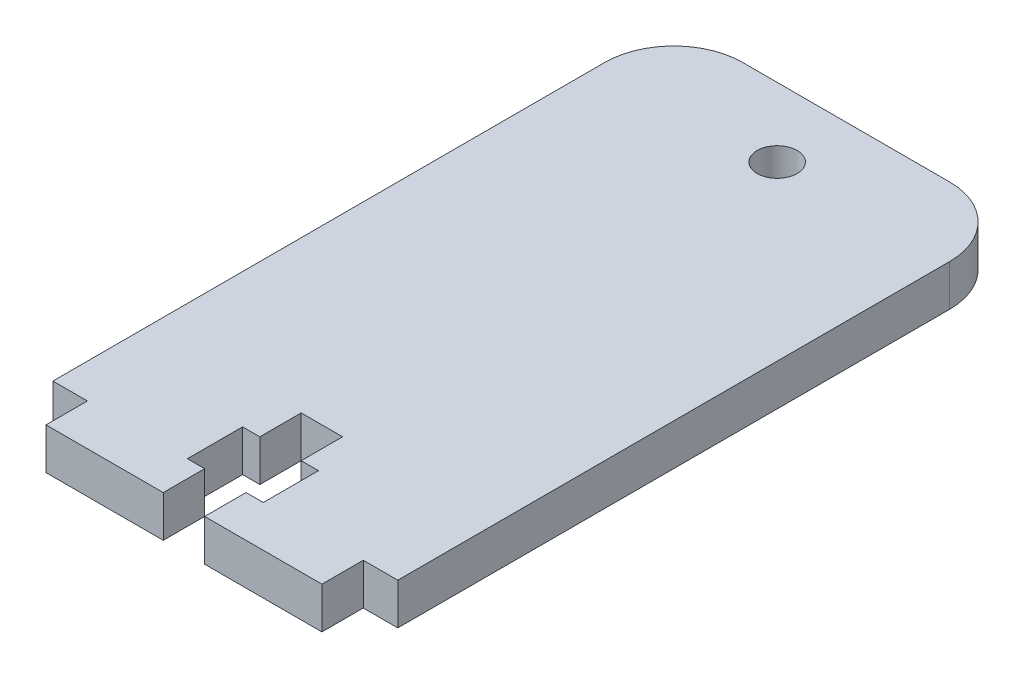
ISO-10303-21;
HEADER;
FILE_DESCRIPTION(('STEP AP214'),'2;1');
FILE_NAME('part.step','',(''),(''),'','','');
FILE_SCHEMA(('AUTOMOTIVE_DESIGN { 1 0 10303 214 1 1 1 1 }'));
ENDSEC;
DATA;
#1=APPLICATION_CONTEXT('core data for automotive mechanical design processes');
#2=APPLICATION_PROTOCOL_DEFINITION('international standard','automotive_design',2000,#1);
#3=PRODUCT_CONTEXT('',#1,'mechanical');
#4=PRODUCT('Part','Part','',(#3));
#5=PRODUCT_RELATED_PRODUCT_CATEGORY('part','',(#4));
#6=PRODUCT_DEFINITION_FORMATION('','',#4);
#7=PRODUCT_DEFINITION_CONTEXT('part definition',#1,'design');
#8=PRODUCT_DEFINITION('design','',#6,#7);
#9=PRODUCT_DEFINITION_SHAPE('','',#8);
#10=(LENGTH_UNIT() NAMED_UNIT(*) SI_UNIT(.MILLI.,.METRE.));
#11=(NAMED_UNIT(*) PLANE_ANGLE_UNIT() SI_UNIT($,.RADIAN.));
#12=(NAMED_UNIT(*) SI_UNIT($,.STERADIAN.) SOLID_ANGLE_UNIT());
#13=UNCERTAINTY_MEASURE_WITH_UNIT(LENGTH_MEASURE(1.E-05),#10,'distance_accuracy_value','');
#14=(GEOMETRIC_REPRESENTATION_CONTEXT(3) GLOBAL_UNCERTAINTY_ASSIGNED_CONTEXT((#13)) GLOBAL_UNIT_ASSIGNED_CONTEXT((#10,
#11,#12)) REPRESENTATION_CONTEXT('',''));
#15=CARTESIAN_POINT('',(0.,0.,0.));
#16=DIRECTION('',(0.,0.,1.));
#17=DIRECTION('',(1.,0.,0.));
#18=AXIS2_PLACEMENT_3D('',#15,#16,#17);
#19=CARTESIAN_POINT('',(0.,3.,0.));
#20=DIRECTION('',(0.,0.,-1.));
#21=DIRECTION('',(-1.,0.,0.));
#22=AXIS2_PLACEMENT_3D('',#19,#20,#21);
#23=PLANE('',#22);
#24=DIRECTION('',(1.,0.,0.));
#25=VECTOR('',#24,1.);
#26=CARTESIAN_POINT('',(0.,0.,0.));
#27=LINE('',#26,#25);
#28=CARTESIAN_POINT('',(5.00000000000004,0.,0.));
#29=VERTEX_POINT('',#28);
#30=CARTESIAN_POINT('',(20.,0.,0.));
#31=VERTEX_POINT('',#30);
#32=EDGE_CURVE('E236',#29,#31,#27,.T.);
#33=ORIENTED_EDGE('',*,*,#32,.F.);
#34=DIRECTION('',(0.,-1.,0.));
#35=VECTOR('',#34,1.);
#36=CARTESIAN_POINT('',(5.00000000000004,3.,0.));
#37=LINE('',#36,#35);
#38=CARTESIAN_POINT('',(5.00000000000004,3.,0.));
#39=VERTEX_POINT('',#38);
#40=EDGE_CURVE('E11',#39,#29,#37,.T.);
#41=ORIENTED_EDGE('',*,*,#40,.F.);
#42=DIRECTION('',(1.,0.,0.));
#43=VECTOR('',#42,1.);
#44=CARTESIAN_POINT('',(0.,3.,0.));
#45=LINE('',#44,#43);
#46=CARTESIAN_POINT('',(20.,3.,0.));
#47=VERTEX_POINT('',#46);
#48=EDGE_CURVE('E474',#39,#47,#45,.T.);
#49=ORIENTED_EDGE('',*,*,#48,.T.);
#50=DIRECTION('',(0.,-1.,0.));
#51=VECTOR('',#50,1.);
#52=CARTESIAN_POINT('',(20.,3.,0.));
#53=LINE('',#52,#51);
#54=EDGE_CURVE('E141',#47,#31,#53,.T.);
#55=ORIENTED_EDGE('',*,*,#54,.T.);
#56=EDGE_LOOP('',(#33,#41,#49,#55));
#57=FACE_BOUND('',#56,.T.);
#58=ADVANCED_FACE('F47',(#57),#23,.T.);
#59=CARTESIAN_POINT('',(5.,3.,5.));
#60=DIRECTION('',(0.,-1.,0.));
#61=DIRECTION('',(0.,0.,-1.));
#62=AXIS2_PLACEMENT_3D('',#59,#60,#61);
#63=CYLINDRICAL_SURFACE('',#62,5.);
#64=CARTESIAN_POINT('',(5.,0.,5.));
#65=DIRECTION('',(0.,1.,0.));
#66=DIRECTION('',(0.,0.,1.));
#67=AXIS2_PLACEMENT_3D('',#64,#65,#66);
#68=CIRCLE('',#67,5.);
#69=CARTESIAN_POINT('',(0.,0.,5.00000000000004));
#70=VERTEX_POINT('',#69);
#71=EDGE_CURVE('E240',#29,#70,#68,.T.);
#72=ORIENTED_EDGE('',*,*,#71,.T.);
#73=DIRECTION('',(0.,-1.,0.));
#74=VECTOR('',#73,1.);
#75=CARTESIAN_POINT('',(0.,3.,5.00000000000004));
#76=LINE('',#75,#74);
#77=CARTESIAN_POINT('',(0.,3.,5.00000000000004));
#78=VERTEX_POINT('',#77);
#79=EDGE_CURVE('E57',#78,#70,#76,.T.);
#80=ORIENTED_EDGE('',*,*,#79,.F.);
#81=CARTESIAN_POINT('',(5.,3.,5.));
#82=DIRECTION('',(0.,1.,0.));
#83=DIRECTION('',(0.,0.,1.));
#84=AXIS2_PLACEMENT_3D('',#81,#82,#83);
#85=CIRCLE('',#84,5.);
#86=EDGE_CURVE('E477',#39,#78,#85,.T.);
#87=ORIENTED_EDGE('',*,*,#86,.F.);
#88=ORIENTED_EDGE('',*,*,#40,.T.);
#89=EDGE_LOOP('',(#72,#80,#87,#88));
#90=FACE_BOUND('',#89,.T.);
#91=ADVANCED_FACE('F387',(#90),#63,.T.);
#92=CARTESIAN_POINT('',(0.,3.,0.));
#93=DIRECTION('',(1.,0.,0.));
#94=DIRECTION('',(0.,0.,-1.));
#95=AXIS2_PLACEMENT_3D('',#92,#93,#94);
#96=PLANE('',#95);
#97=DIRECTION('',(0.,0.,1.));
#98=VECTOR('',#97,1.);
#99=CARTESIAN_POINT('',(0.,0.,0.));
#100=LINE('',#99,#98);
#101=CARTESIAN_POINT('',(0.,0.,45.));
#102=VERTEX_POINT('',#101);
#103=EDGE_CURVE('E244',#70,#102,#100,.T.);
#104=ORIENTED_EDGE('',*,*,#103,.T.);
#105=DIRECTION('',(0.,-1.,0.));
#106=VECTOR('',#105,1.);
#107=CARTESIAN_POINT('',(0.,3.,45.));
#108=LINE('',#107,#106);
#109=CARTESIAN_POINT('',(0.,3.,45.));
#110=VERTEX_POINT('',#109);
#111=EDGE_CURVE('E373',#110,#102,#108,.T.);
#112=ORIENTED_EDGE('',*,*,#111,.F.);
#113=DIRECTION('',(0.,0.,1.));
#114=VECTOR('',#113,1.);
#115=CARTESIAN_POINT('',(0.,3.,0.));
#116=LINE('',#115,#114);
#117=EDGE_CURVE('E383',#78,#110,#116,.T.);
#118=ORIENTED_EDGE('',*,*,#117,.F.);
#119=ORIENTED_EDGE('',*,*,#79,.T.);
#120=EDGE_LOOP('',(#104,#112,#118,#119));
#121=FACE_BOUND('',#120,.T.);
#122=ADVANCED_FACE('F380',(#121),#96,.F.);
#123=CARTESIAN_POINT('',(0.,3.,45.));
#124=DIRECTION('',(0.,0.,-1.));
#125=DIRECTION('',(-1.,0.,0.));
#126=AXIS2_PLACEMENT_3D('',#123,#124,#125);
#127=PLANE('',#126);
#128=DIRECTION('',(1.,0.,0.));
#129=VECTOR('',#128,1.);
#130=CARTESIAN_POINT('',(0.,0.,45.));
#131=LINE('',#130,#129);
#132=CARTESIAN_POINT('',(2.50000000000001,0.,45.));
#133=VERTEX_POINT('',#132);
#134=EDGE_CURVE('E248',#102,#133,#131,.T.);
#135=ORIENTED_EDGE('',*,*,#134,.T.);
#136=DIRECTION('',(0.,-1.,0.));
#137=VECTOR('',#136,1.);
#138=CARTESIAN_POINT('',(2.50000000000001,3.,45.));
#139=LINE('',#138,#137);
#140=CARTESIAN_POINT('',(2.50000000000001,3.,45.));
#141=VERTEX_POINT('',#140);
#142=EDGE_CURVE('E369',#141,#133,#139,.T.);
#143=ORIENTED_EDGE('',*,*,#142,.F.);
#144=DIRECTION('',(1.,0.,0.));
#145=VECTOR('',#144,1.);
#146=CARTESIAN_POINT('',(0.,3.,45.));
#147=LINE('',#146,#145);
#148=EDGE_CURVE('E212',#110,#141,#147,.T.);
#149=ORIENTED_EDGE('',*,*,#148,.F.);
#150=ORIENTED_EDGE('',*,*,#111,.T.);
#151=EDGE_LOOP('',(#135,#143,#149,#150));
#152=FACE_BOUND('',#151,.T.);
#153=ADVANCED_FACE('F398',(#152),#127,.F.);
#154=CARTESIAN_POINT('',(2.5,3.,0.));
#155=DIRECTION('',(1.,0.,0.));
#156=DIRECTION('',(0.,0.,-1.));
#157=AXIS2_PLACEMENT_3D('',#154,#155,#156);
#158=PLANE('',#157);
#159=DIRECTION('',(0.,0.,1.));
#160=VECTOR('',#159,1.);
#161=CARTESIAN_POINT('',(2.5,0.,0.));
#162=LINE('',#161,#160);
#163=CARTESIAN_POINT('',(2.50000000000001,0.,48.));
#164=VERTEX_POINT('',#163);
#165=EDGE_CURVE('E252',#133,#164,#162,.T.);
#166=ORIENTED_EDGE('',*,*,#165,.T.);
#167=DIRECTION('',(0.,-1.,0.));
#168=VECTOR('',#167,1.);
#169=CARTESIAN_POINT('',(2.50000000000001,3.,48.));
#170=LINE('',#169,#168);
#171=CARTESIAN_POINT('',(2.50000000000001,3.,48.));
#172=VERTEX_POINT('',#171);
#173=EDGE_CURVE('E365',#172,#164,#170,.T.);
#174=ORIENTED_EDGE('',*,*,#173,.F.);
#175=DIRECTION('',(0.,0.,1.));
#176=VECTOR('',#175,1.);
#177=CARTESIAN_POINT('',(2.5,3.,0.));
#178=LINE('',#177,#176);
#179=EDGE_CURVE('E486',#141,#172,#178,.T.);
#180=ORIENTED_EDGE('',*,*,#179,.F.);
#181=ORIENTED_EDGE('',*,*,#142,.T.);
#182=EDGE_LOOP('',(#166,#174,#180,#181));
#183=FACE_BOUND('',#182,.T.);
#184=ADVANCED_FACE('F399',(#183),#158,.F.);
#185=CARTESIAN_POINT('',(0.,3.,48.));
#186=DIRECTION('',(0.,0.,-1.));
#187=DIRECTION('',(-1.,0.,0.));
#188=AXIS2_PLACEMENT_3D('',#185,#186,#187);
#189=PLANE('',#188);
#190=DIRECTION('',(1.,0.,0.));
#191=VECTOR('',#190,1.);
#192=CARTESIAN_POINT('',(0.,0.,48.));
#193=LINE('',#192,#191);
#194=CARTESIAN_POINT('',(11.,0.,48.));
#195=VERTEX_POINT('',#194);
#196=EDGE_CURVE('E256',#164,#195,#193,.T.);
#197=ORIENTED_EDGE('',*,*,#196,.T.);
#198=DIRECTION('',(0.,-1.,0.));
#199=VECTOR('',#198,1.);
#200=CARTESIAN_POINT('',(11.,3.,48.));
#201=LINE('',#200,#199);
#202=CARTESIAN_POINT('',(11.,3.,48.));
#203=VERTEX_POINT('',#202);
#204=EDGE_CURVE('E361',#203,#195,#201,.T.);
#205=ORIENTED_EDGE('',*,*,#204,.F.);
#206=DIRECTION('',(1.,0.,0.));
#207=VECTOR('',#206,1.);
#208=CARTESIAN_POINT('',(0.,3.,48.));
#209=LINE('',#208,#207);
#210=EDGE_CURVE('E490',#172,#203,#209,.T.);
#211=ORIENTED_EDGE('',*,*,#210,.F.);
#212=ORIENTED_EDGE('',*,*,#173,.T.);
#213=EDGE_LOOP('',(#197,#205,#211,#212));
#214=FACE_BOUND('',#213,.T.);
#215=ADVANCED_FACE('F402',(#214),#189,.F.);
#216=CARTESIAN_POINT('',(11.,3.,0.));
#217=DIRECTION('',(-1.,0.,0.));
#218=DIRECTION('',(0.,0.,1.));
#219=AXIS2_PLACEMENT_3D('',#216,#217,#218);
#220=PLANE('',#219);
#221=DIRECTION('',(0.,0.,-1.));
#222=VECTOR('',#221,1.);
#223=CARTESIAN_POINT('',(11.,0.,0.));
#224=LINE('',#223,#222);
#225=CARTESIAN_POINT('',(11.,0.,45.));
#226=VERTEX_POINT('',#225);
#227=EDGE_CURVE('E260',#195,#226,#224,.T.);
#228=ORIENTED_EDGE('',*,*,#227,.T.);
#229=DIRECTION('',(0.,-1.,0.));
#230=VECTOR('',#229,1.);
#231=CARTESIAN_POINT('',(11.,3.,45.));
#232=LINE('',#231,#230);
#233=CARTESIAN_POINT('',(11.,3.,45.));
#234=VERTEX_POINT('',#233);
#235=EDGE_CURVE('E358',#234,#226,#232,.T.);
#236=ORIENTED_EDGE('',*,*,#235,.F.);
#237=DIRECTION('',(0.,0.,-1.));
#238=VECTOR('',#237,1.);
#239=CARTESIAN_POINT('',(11.,3.,0.));
#240=LINE('',#239,#238);
#241=EDGE_CURVE('E494',#203,#234,#240,.T.);
#242=ORIENTED_EDGE('',*,*,#241,.F.);
#243=ORIENTED_EDGE('',*,*,#204,.T.);
#244=EDGE_LOOP('',(#228,#236,#242,#243));
#245=FACE_BOUND('',#244,.T.);
#246=ADVANCED_FACE('F406',(#245),#220,.F.);
#247=CARTESIAN_POINT('',(0.,3.,45.));
#248=DIRECTION('',(0.,0.,-1.));
#249=DIRECTION('',(-1.,0.,0.));
#250=AXIS2_PLACEMENT_3D('',#247,#248,#249);
#251=PLANE('',#250);
#252=DIRECTION('',(1.,0.,0.));
#253=VECTOR('',#252,1.);
#254=CARTESIAN_POINT('',(0.,0.,45.));
#255=LINE('',#254,#253);
#256=CARTESIAN_POINT('',(9.75000000000001,0.,45.));
#257=VERTEX_POINT('',#256);
#258=EDGE_CURVE('E264',#257,#226,#255,.T.);
#259=ORIENTED_EDGE('',*,*,#258,.F.);
#260=DIRECTION('',(0.,-1.,0.));
#261=VECTOR('',#260,1.);
#262=CARTESIAN_POINT('',(9.75000000000001,3.,45.));
#263=LINE('',#262,#261);
#264=CARTESIAN_POINT('',(9.75000000000001,3.,45.));
#265=VERTEX_POINT('',#264);
#266=EDGE_CURVE('E355',#265,#257,#263,.T.);
#267=ORIENTED_EDGE('',*,*,#266,.F.);
#268=DIRECTION('',(1.,0.,0.));
#269=VECTOR('',#268,1.);
#270=CARTESIAN_POINT('',(0.,3.,45.));
#271=LINE('',#270,#269);
#272=EDGE_CURVE('E497',#265,#234,#271,.T.);
#273=ORIENTED_EDGE('',*,*,#272,.T.);
#274=ORIENTED_EDGE('',*,*,#235,.T.);
#275=EDGE_LOOP('',(#259,#267,#273,#274));
#276=FACE_BOUND('',#275,.T.);
#277=ADVANCED_FACE('F410',(#276),#251,.T.);
#278=CARTESIAN_POINT('',(9.75000000000001,3.,0.));
#279=DIRECTION('',(1.,0.,0.));
#280=DIRECTION('',(0.,0.,-1.));
#281=AXIS2_PLACEMENT_3D('',#278,#279,#280);
#282=PLANE('',#281);
#283=DIRECTION('',(0.,0.,1.));
#284=VECTOR('',#283,1.);
#285=CARTESIAN_POINT('',(9.75000000000001,0.,0.));
#286=LINE('',#285,#284);
#287=CARTESIAN_POINT('',(9.75000000000001,0.,41.));
#288=VERTEX_POINT('',#287);
#289=EDGE_CURVE('E268',#288,#257,#286,.T.);
#290=ORIENTED_EDGE('',*,*,#289,.F.);
#291=DIRECTION('',(0.,-1.,0.));
#292=VECTOR('',#291,1.);
#293=CARTESIAN_POINT('',(9.75000000000001,3.,41.));
#294=LINE('',#293,#292);
#295=CARTESIAN_POINT('',(9.75000000000001,3.,41.));
#296=VERTEX_POINT('',#295);
#297=EDGE_CURVE('E352',#296,#288,#294,.T.);
#298=ORIENTED_EDGE('',*,*,#297,.F.);
#299=DIRECTION('',(0.,0.,1.));
#300=VECTOR('',#299,1.);
#301=CARTESIAN_POINT('',(9.75000000000001,3.,0.));
#302=LINE('',#301,#300);
#303=EDGE_CURVE('E501',#296,#265,#302,.T.);
#304=ORIENTED_EDGE('',*,*,#303,.T.);
#305=ORIENTED_EDGE('',*,*,#266,.T.);
#306=EDGE_LOOP('',(#290,#298,#304,#305));
#307=FACE_BOUND('',#306,.T.);
#308=ADVANCED_FACE('F414',(#307),#282,.T.);
#309=CARTESIAN_POINT('',(0.,3.,41.));
#310=DIRECTION('',(0.,0.,-1.));
#311=DIRECTION('',(-1.,0.,0.));
#312=AXIS2_PLACEMENT_3D('',#309,#310,#311);
#313=PLANE('',#312);
#314=DIRECTION('',(1.,0.,0.));
#315=VECTOR('',#314,1.);
#316=CARTESIAN_POINT('',(0.,0.,41.));
#317=LINE('',#316,#315);
#318=CARTESIAN_POINT('',(11.,0.,41.));
#319=VERTEX_POINT('',#318);
#320=EDGE_CURVE('E272',#288,#319,#317,.T.);
#321=ORIENTED_EDGE('',*,*,#320,.T.);
#322=DIRECTION('',(0.,-1.,0.));
#323=VECTOR('',#322,1.);
#324=CARTESIAN_POINT('',(11.,3.,41.));
#325=LINE('',#324,#323);
#326=CARTESIAN_POINT('',(11.,3.,41.));
#327=VERTEX_POINT('',#326);
#328=EDGE_CURVE('E348',#327,#319,#325,.T.);
#329=ORIENTED_EDGE('',*,*,#328,.F.);
#330=DIRECTION('',(1.,0.,0.));
#331=VECTOR('',#330,1.);
#332=CARTESIAN_POINT('',(0.,3.,41.));
#333=LINE('',#332,#331);
#334=EDGE_CURVE('E505',#296,#327,#333,.T.);
#335=ORIENTED_EDGE('',*,*,#334,.F.);
#336=ORIENTED_EDGE('',*,*,#297,.T.);
#337=EDGE_LOOP('',(#321,#329,#335,#336));
#338=FACE_BOUND('',#337,.T.);
#339=ADVANCED_FACE('F418',(#338),#313,.F.);
#340=CARTESIAN_POINT('',(11.,3.,0.));
#341=DIRECTION('',(-1.,0.,0.));
#342=DIRECTION('',(0.,0.,1.));
#343=AXIS2_PLACEMENT_3D('',#340,#341,#342);
#344=PLANE('',#343);
#345=DIRECTION('',(0.,0.,-1.));
#346=VECTOR('',#345,1.);
#347=CARTESIAN_POINT('',(11.,0.,0.));
#348=LINE('',#347,#346);
#349=CARTESIAN_POINT('',(11.,0.,38.));
#350=VERTEX_POINT('',#349);
#351=EDGE_CURVE('E276',#319,#350,#348,.T.);
#352=ORIENTED_EDGE('',*,*,#351,.T.);
#353=DIRECTION('',(0.,-1.,0.));
#354=VECTOR('',#353,1.);
#355=CARTESIAN_POINT('',(11.,3.,38.));
#356=LINE('',#355,#354);
#357=CARTESIAN_POINT('',(11.,3.,38.));
#358=VERTEX_POINT('',#357);
#359=EDGE_CURVE('E344',#358,#350,#356,.T.);
#360=ORIENTED_EDGE('',*,*,#359,.F.);
#361=DIRECTION('',(0.,0.,-1.));
#362=VECTOR('',#361,1.);
#363=CARTESIAN_POINT('',(11.,3.,0.));
#364=LINE('',#363,#362);
#365=EDGE_CURVE('E509',#327,#358,#364,.T.);
#366=ORIENTED_EDGE('',*,*,#365,.F.);
#367=ORIENTED_EDGE('',*,*,#328,.T.);
#368=EDGE_LOOP('',(#352,#360,#366,#367));
#369=FACE_BOUND('',#368,.T.);
#370=ADVANCED_FACE('F420',(#369),#344,.F.);
#371=CARTESIAN_POINT('',(0.,3.,38.));
#372=DIRECTION('',(0.,0.,-1.));
#373=DIRECTION('',(-1.,0.,0.));
#374=AXIS2_PLACEMENT_3D('',#371,#372,#373);
#375=PLANE('',#374);
#376=DIRECTION('',(1.,0.,0.));
#377=VECTOR('',#376,1.);
#378=CARTESIAN_POINT('',(0.,0.,38.));
#379=LINE('',#378,#377);
#380=CARTESIAN_POINT('',(14.,0.,38.));
#381=VERTEX_POINT('',#380);
#382=EDGE_CURVE('E281',#350,#381,#379,.T.);
#383=ORIENTED_EDGE('',*,*,#382,.T.);
#384=DIRECTION('',(0.,-1.,0.));
#385=VECTOR('',#384,1.);
#386=CARTESIAN_POINT('',(14.,3.,38.));
#387=LINE('',#386,#385);
#388=CARTESIAN_POINT('',(14.,3.,38.));
#389=VERTEX_POINT('',#388);
#390=EDGE_CURVE('E341',#389,#381,#387,.T.);
#391=ORIENTED_EDGE('',*,*,#390,.F.);
#392=DIRECTION('',(1.,0.,0.));
#393=VECTOR('',#392,1.);
#394=CARTESIAN_POINT('',(0.,3.,38.));
#395=LINE('',#394,#393);
#396=EDGE_CURVE('E514',#358,#389,#395,.T.);
#397=ORIENTED_EDGE('',*,*,#396,.F.);
#398=ORIENTED_EDGE('',*,*,#359,.T.);
#399=EDGE_LOOP('',(#383,#391,#397,#398));
#400=FACE_BOUND('',#399,.T.);
#401=ADVANCED_FACE('F423',(#400),#375,.F.);
#402=CARTESIAN_POINT('',(14.,3.,0.));
#403=DIRECTION('',(-1.,0.,0.));
#404=DIRECTION('',(0.,0.,1.));
#405=AXIS2_PLACEMENT_3D('',#402,#403,#404);
#406=PLANE('',#405);
#407=DIRECTION('',(0.,0.,-1.));
#408=VECTOR('',#407,1.);
#409=CARTESIAN_POINT('',(14.,0.,0.));
#410=LINE('',#409,#408);
#411=CARTESIAN_POINT('',(14.,0.,41.));
#412=VERTEX_POINT('',#411);
#413=EDGE_CURVE('E285',#412,#381,#410,.T.);
#414=ORIENTED_EDGE('',*,*,#413,.F.);
#415=DIRECTION('',(0.,-1.,0.));
#416=VECTOR('',#415,1.);
#417=CARTESIAN_POINT('',(14.,3.,41.));
#418=LINE('',#417,#416);
#419=CARTESIAN_POINT('',(14.,3.,41.));
#420=VERTEX_POINT('',#419);
#421=EDGE_CURVE('E338',#420,#412,#418,.T.);
#422=ORIENTED_EDGE('',*,*,#421,.F.);
#423=DIRECTION('',(0.,0.,-1.));
#424=VECTOR('',#423,1.);
#425=CARTESIAN_POINT('',(14.,3.,0.));
#426=LINE('',#425,#424);
#427=EDGE_CURVE('E517',#420,#389,#426,.T.);
#428=ORIENTED_EDGE('',*,*,#427,.T.);
#429=ORIENTED_EDGE('',*,*,#390,.T.);
#430=EDGE_LOOP('',(#414,#422,#428,#429));
#431=FACE_BOUND('',#430,.T.);
#432=ADVANCED_FACE('F427',(#431),#406,.T.);
#433=CARTESIAN_POINT('',(15.25,0.,41.));
#434=VERTEX_POINT('',#433);
#435=EDGE_CURVE('E277',#412,#434,#317,.T.);
#436=ORIENTED_EDGE('',*,*,#435,.T.);
#437=DIRECTION('',(0.,-1.,0.));
#438=VECTOR('',#437,1.);
#439=CARTESIAN_POINT('',(15.25,3.,41.));
#440=LINE('',#439,#438);
#441=CARTESIAN_POINT('',(15.25,3.,41.));
#442=VERTEX_POINT('',#441);
#443=EDGE_CURVE('E334',#442,#434,#440,.T.);
#444=ORIENTED_EDGE('',*,*,#443,.F.);
#445=EDGE_CURVE('E510',#420,#442,#333,.T.);
#446=ORIENTED_EDGE('',*,*,#445,.F.);
#447=ORIENTED_EDGE('',*,*,#421,.T.);
#448=EDGE_LOOP('',(#436,#444,#446,#447));
#449=FACE_BOUND('',#448,.T.);
#450=ADVANCED_FACE('F431',(#449),#313,.F.);
#451=CARTESIAN_POINT('',(15.25,3.,0.));
#452=DIRECTION('',(1.,0.,0.));
#453=DIRECTION('',(0.,0.,-1.));
#454=AXIS2_PLACEMENT_3D('',#451,#452,#453);
#455=PLANE('',#454);
#456=DIRECTION('',(0.,0.,1.));
#457=VECTOR('',#456,1.);
#458=CARTESIAN_POINT('',(15.25,0.,0.));
#459=LINE('',#458,#457);
#460=CARTESIAN_POINT('',(15.25,0.,45.));
#461=VERTEX_POINT('',#460);
#462=EDGE_CURVE('E289',#434,#461,#459,.T.);
#463=ORIENTED_EDGE('',*,*,#462,.T.);
#464=DIRECTION('',(0.,-1.,0.));
#465=VECTOR('',#464,1.);
#466=CARTESIAN_POINT('',(15.25,3.,45.));
#467=LINE('',#466,#465);
#468=CARTESIAN_POINT('',(15.25,3.,45.));
#469=VERTEX_POINT('',#468);
#470=EDGE_CURVE('E331',#469,#461,#467,.T.);
#471=ORIENTED_EDGE('',*,*,#470,.F.);
#472=DIRECTION('',(0.,0.,1.));
#473=VECTOR('',#472,1.);
#474=CARTESIAN_POINT('',(15.25,3.,0.));
#475=LINE('',#474,#473);
#476=EDGE_CURVE('E521',#442,#469,#475,.T.);
#477=ORIENTED_EDGE('',*,*,#476,.F.);
#478=ORIENTED_EDGE('',*,*,#443,.T.);
#479=EDGE_LOOP('',(#463,#471,#477,#478));
#480=FACE_BOUND('',#479,.T.);
#481=ADVANCED_FACE('F435',(#480),#455,.F.);
#482=CARTESIAN_POINT('',(0.,3.,45.));
#483=DIRECTION('',(0.,0.,-1.));
#484=DIRECTION('',(-1.,0.,0.));
#485=AXIS2_PLACEMENT_3D('',#482,#483,#484);
#486=PLANE('',#485);
#487=DIRECTION('',(1.,0.,0.));
#488=VECTOR('',#487,1.);
#489=CARTESIAN_POINT('',(0.,0.,45.));
#490=LINE('',#489,#488);
#491=CARTESIAN_POINT('',(14.,0.,45.));
#492=VERTEX_POINT('',#491);
#493=EDGE_CURVE('E293',#492,#461,#490,.T.);
#494=ORIENTED_EDGE('',*,*,#493,.F.);
#495=DIRECTION('',(0.,-1.,0.));
#496=VECTOR('',#495,1.);
#497=CARTESIAN_POINT('',(14.,3.,45.));
#498=LINE('',#497,#496);
#499=CARTESIAN_POINT('',(14.,3.,45.));
#500=VERTEX_POINT('',#499);
#501=EDGE_CURVE('E328',#500,#492,#498,.T.);
#502=ORIENTED_EDGE('',*,*,#501,.F.);
#503=DIRECTION('',(1.,0.,0.));
#504=VECTOR('',#503,1.);
#505=CARTESIAN_POINT('',(0.,3.,45.));
#506=LINE('',#505,#504);
#507=EDGE_CURVE('E524',#500,#469,#506,.T.);
#508=ORIENTED_EDGE('',*,*,#507,.T.);
#509=ORIENTED_EDGE('',*,*,#470,.T.);
#510=EDGE_LOOP('',(#494,#502,#508,#509));
#511=FACE_BOUND('',#510,.T.);
#512=ADVANCED_FACE('F439',(#511),#486,.T.);
#513=CARTESIAN_POINT('',(14.,3.,0.));
#514=DIRECTION('',(-1.,0.,0.));
#515=DIRECTION('',(0.,0.,1.));
#516=AXIS2_PLACEMENT_3D('',#513,#514,#515);
#517=PLANE('',#516);
#518=DIRECTION('',(0.,0.,-1.));
#519=VECTOR('',#518,1.);
#520=CARTESIAN_POINT('',(14.,0.,0.));
#521=LINE('',#520,#519);
#522=CARTESIAN_POINT('',(14.,0.,48.));
#523=VERTEX_POINT('',#522);
#524=EDGE_CURVE('E297',#523,#492,#521,.T.);
#525=ORIENTED_EDGE('',*,*,#524,.F.);
#526=DIRECTION('',(0.,-1.,0.));
#527=VECTOR('',#526,1.);
#528=CARTESIAN_POINT('',(14.,3.,48.));
#529=LINE('',#528,#527);
#530=CARTESIAN_POINT('',(14.,3.,48.));
#531=VERTEX_POINT('',#530);
#532=EDGE_CURVE('E325',#531,#523,#529,.T.);
#533=ORIENTED_EDGE('',*,*,#532,.F.);
#534=DIRECTION('',(0.,0.,-1.));
#535=VECTOR('',#534,1.);
#536=CARTESIAN_POINT('',(14.,3.,0.));
#537=LINE('',#536,#535);
#538=EDGE_CURVE('E528',#531,#500,#537,.T.);
#539=ORIENTED_EDGE('',*,*,#538,.T.);
#540=ORIENTED_EDGE('',*,*,#501,.T.);
#541=EDGE_LOOP('',(#525,#533,#539,#540));
#542=FACE_BOUND('',#541,.T.);
#543=ADVANCED_FACE('F443',(#542),#517,.T.);
#544=CARTESIAN_POINT('',(0.,3.,48.));
#545=DIRECTION('',(0.,0.,-1.));
#546=DIRECTION('',(-1.,0.,0.));
#547=AXIS2_PLACEMENT_3D('',#544,#545,#546);
#548=PLANE('',#547);
#549=DIRECTION('',(1.,0.,0.));
#550=VECTOR('',#549,1.);
#551=CARTESIAN_POINT('',(0.,0.,48.));
#552=LINE('',#551,#550);
#553=CARTESIAN_POINT('',(22.5,0.,48.));
#554=VERTEX_POINT('',#553);
#555=EDGE_CURVE('E301',#523,#554,#552,.T.);
#556=ORIENTED_EDGE('',*,*,#555,.T.);
#557=DIRECTION('',(0.,-1.,0.));
#558=VECTOR('',#557,1.);
#559=CARTESIAN_POINT('',(22.5,3.,48.));
#560=LINE('',#559,#558);
#561=CARTESIAN_POINT('',(22.5,3.,48.));
#562=VERTEX_POINT('',#561);
#563=EDGE_CURVE('E322',#562,#554,#560,.T.);
#564=ORIENTED_EDGE('',*,*,#563,.F.);
#565=DIRECTION('',(1.,0.,0.));
#566=VECTOR('',#565,1.);
#567=CARTESIAN_POINT('',(0.,3.,48.));
#568=LINE('',#567,#566);
#569=EDGE_CURVE('E531',#531,#562,#568,.T.);
#570=ORIENTED_EDGE('',*,*,#569,.F.);
#571=ORIENTED_EDGE('',*,*,#532,.T.);
#572=EDGE_LOOP('',(#556,#564,#570,#571));
#573=FACE_BOUND('',#572,.T.);
#574=ADVANCED_FACE('F447',(#573),#548,.F.);
#575=CARTESIAN_POINT('',(22.5,3.,0.));
#576=DIRECTION('',(1.,0.,0.));
#577=DIRECTION('',(0.,0.,-1.));
#578=AXIS2_PLACEMENT_3D('',#575,#576,#577);
#579=PLANE('',#578);
#580=DIRECTION('',(0.,0.,1.));
#581=VECTOR('',#580,1.);
#582=CARTESIAN_POINT('',(22.5,0.,0.));
#583=LINE('',#582,#581);
#584=CARTESIAN_POINT('',(22.5,0.,45.));
#585=VERTEX_POINT('',#584);
#586=EDGE_CURVE('E305',#585,#554,#583,.T.);
#587=ORIENTED_EDGE('',*,*,#586,.F.);
#588=DIRECTION('',(0.,-1.,0.));
#589=VECTOR('',#588,1.);
#590=CARTESIAN_POINT('',(22.5,3.,45.));
#591=LINE('',#590,#589);
#592=CARTESIAN_POINT('',(22.5,3.,45.));
#593=VERTEX_POINT('',#592);
#594=EDGE_CURVE('E222',#593,#585,#591,.T.);
#595=ORIENTED_EDGE('',*,*,#594,.F.);
#596=DIRECTION('',(0.,0.,1.));
#597=VECTOR('',#596,1.);
#598=CARTESIAN_POINT('',(22.5,3.,0.));
#599=LINE('',#598,#597);
#600=EDGE_CURVE('E208',#593,#562,#599,.T.);
#601=ORIENTED_EDGE('',*,*,#600,.T.);
#602=ORIENTED_EDGE('',*,*,#563,.T.);
#603=EDGE_LOOP('',(#587,#595,#601,#602));
#604=FACE_BOUND('',#603,.T.);
#605=ADVANCED_FACE('F451',(#604),#579,.T.);
#606=CARTESIAN_POINT('',(25.,0.,45.));
#607=VERTEX_POINT('',#606);
#608=EDGE_CURVE('E217',#585,#607,#131,.T.);
#609=ORIENTED_EDGE('',*,*,#608,.T.);
#610=DIRECTION('',(0.,-1.,0.));
#611=VECTOR('',#610,1.);
#612=CARTESIAN_POINT('',(25.,3.,45.));
#613=LINE('',#612,#611);
#614=CARTESIAN_POINT('',(25.,3.,45.));
#615=VERTEX_POINT('',#614);
#616=EDGE_CURVE('E214',#615,#607,#613,.T.);
#617=ORIENTED_EDGE('',*,*,#616,.F.);
#618=EDGE_CURVE('E202',#593,#615,#147,.T.);
#619=ORIENTED_EDGE('',*,*,#618,.F.);
#620=ORIENTED_EDGE('',*,*,#594,.T.);
#621=EDGE_LOOP('',(#609,#617,#619,#620));
#622=FACE_BOUND('',#621,.T.);
#623=ADVANCED_FACE('F215',(#622),#127,.F.);
#624=CARTESIAN_POINT('',(25.,3.,0.));
#625=DIRECTION('',(1.,0.,0.));
#626=DIRECTION('',(0.,0.,-1.));
#627=AXIS2_PLACEMENT_3D('',#624,#625,#626);
#628=PLANE('',#627);
#629=DIRECTION('',(0.,0.,1.));
#630=VECTOR('',#629,1.);
#631=CARTESIAN_POINT('',(25.,0.,0.));
#632=LINE('',#631,#630);
#633=CARTESIAN_POINT('',(25.,0.,5.00000000000004));
#634=VERTEX_POINT('',#633);
#635=EDGE_CURVE('E309',#634,#607,#632,.T.);
#636=ORIENTED_EDGE('',*,*,#635,.F.);
#637=DIRECTION('',(0.,-1.,0.));
#638=VECTOR('',#637,1.);
#639=CARTESIAN_POINT('',(25.,3.,5.00000000000004));
#640=LINE('',#639,#638);
#641=CARTESIAN_POINT('',(25.,3.,5.00000000000004));
#642=VERTEX_POINT('',#641);
#643=EDGE_CURVE('E134',#642,#634,#640,.T.);
#644=ORIENTED_EDGE('',*,*,#643,.F.);
#645=DIRECTION('',(0.,0.,1.));
#646=VECTOR('',#645,1.);
#647=CARTESIAN_POINT('',(25.,3.,0.));
#648=LINE('',#647,#646);
#649=EDGE_CURVE('E206',#642,#615,#648,.T.);
#650=ORIENTED_EDGE('',*,*,#649,.T.);
#651=ORIENTED_EDGE('',*,*,#616,.T.);
#652=EDGE_LOOP('',(#636,#644,#650,#651));
#653=FACE_BOUND('',#652,.T.);
#654=ADVANCED_FACE('F224',(#653),#628,.T.);
#655=CARTESIAN_POINT('',(12.5,3.,5.));
#656=DIRECTION('',(0.,-1.,0.));
#657=DIRECTION('',(0.,0.,-1.));
#658=AXIS2_PLACEMENT_3D('',#655,#656,#657);
#659=CYLINDRICAL_SURFACE('',#658,1.45);
#660=CARTESIAN_POINT('',(12.5,3.,5.));
#661=DIRECTION('',(0.,1.,0.));
#662=DIRECTION('',(0.,0.,1.));
#663=AXIS2_PLACEMENT_3D('',#660,#661,#662);
#664=CIRCLE('',#663,1.45);
#665=CARTESIAN_POINT('',(12.5,3.,6.45));
#666=VERTEX_POINT('',#665);
#667=EDGE_CURVE('E315',#666,#666,#664,.T.);
#668=ORIENTED_EDGE('',*,*,#667,.T.);
#669=EDGE_LOOP('',(#668));
#670=FACE_BOUND('',#669,.T.);
#671=CARTESIAN_POINT('',(12.5,0.,5.));
#672=DIRECTION('',(0.,1.,0.));
#673=DIRECTION('',(0.,0.,1.));
#674=AXIS2_PLACEMENT_3D('',#671,#672,#673);
#675=CIRCLE('',#674,1.45);
#676=CARTESIAN_POINT('',(12.5,0.,6.45));
#677=VERTEX_POINT('',#676);
#678=EDGE_CURVE('E232',#677,#677,#675,.T.);
#679=ORIENTED_EDGE('',*,*,#678,.F.);
#680=EDGE_LOOP('',(#679));
#681=FACE_BOUND('',#680,.T.);
#682=ADVANCED_FACE('F49',(#670,#681),#659,.F.);
#683=CARTESIAN_POINT('',(20.,3.,5.));
#684=DIRECTION('',(0.,-1.,0.));
#685=DIRECTION('',(0.,0.,-1.));
#686=AXIS2_PLACEMENT_3D('',#683,#684,#685);
#687=CYLINDRICAL_SURFACE('',#686,5.);
#688=CARTESIAN_POINT('',(20.,0.,5.));
#689=DIRECTION('',(0.,1.,0.));
#690=DIRECTION('',(0.,0.,1.));
#691=AXIS2_PLACEMENT_3D('',#688,#689,#690);
#692=CIRCLE('',#691,5.);
#693=EDGE_CURVE('E312',#634,#31,#692,.T.);
#694=ORIENTED_EDGE('',*,*,#693,.T.);
#695=ORIENTED_EDGE('',*,*,#54,.F.);
#696=CARTESIAN_POINT('',(20.,3.,5.));
#697=DIRECTION('',(0.,1.,0.));
#698=DIRECTION('',(0.,0.,1.));
#699=AXIS2_PLACEMENT_3D('',#696,#697,#698);
#700=CIRCLE('',#699,5.);
#701=EDGE_CURVE('E65',#642,#47,#700,.T.);
#702=ORIENTED_EDGE('',*,*,#701,.F.);
#703=ORIENTED_EDGE('',*,*,#643,.T.);
#704=EDGE_LOOP('',(#694,#695,#702,#703));
#705=FACE_BOUND('',#704,.T.);
#706=ADVANCED_FACE('F460',(#705),#687,.T.);
#707=CARTESIAN_POINT('',(0.,3.,0.));
#708=DIRECTION('',(0.,1.,0.));
#709=DIRECTION('',(0.,0.,1.));
#710=AXIS2_PLACEMENT_3D('',#707,#708,#709);
#711=PLANE('',#710);
#712=ORIENTED_EDGE('',*,*,#667,.F.);
#713=EDGE_LOOP('',(#712));
#714=FACE_BOUND('',#713,.T.);
#715=ORIENTED_EDGE('',*,*,#48,.F.);
#716=ORIENTED_EDGE('',*,*,#86,.T.);
#717=ORIENTED_EDGE('',*,*,#117,.T.);
#718=ORIENTED_EDGE('',*,*,#148,.T.);
#719=ORIENTED_EDGE('',*,*,#179,.T.);
#720=ORIENTED_EDGE('',*,*,#210,.T.);
#721=ORIENTED_EDGE('',*,*,#241,.T.);
#722=ORIENTED_EDGE('',*,*,#272,.F.);
#723=ORIENTED_EDGE('',*,*,#303,.F.);
#724=ORIENTED_EDGE('',*,*,#334,.T.);
#725=ORIENTED_EDGE('',*,*,#365,.T.);
#726=ORIENTED_EDGE('',*,*,#396,.T.);
#727=ORIENTED_EDGE('',*,*,#427,.F.);
#728=ORIENTED_EDGE('',*,*,#445,.T.);
#729=ORIENTED_EDGE('',*,*,#476,.T.);
#730=ORIENTED_EDGE('',*,*,#507,.F.);
#731=ORIENTED_EDGE('',*,*,#538,.F.);
#732=ORIENTED_EDGE('',*,*,#569,.T.);
#733=ORIENTED_EDGE('',*,*,#600,.F.);
#734=ORIENTED_EDGE('',*,*,#618,.T.);
#735=ORIENTED_EDGE('',*,*,#649,.F.);
#736=ORIENTED_EDGE('',*,*,#701,.T.);
#737=EDGE_LOOP('',(#715,#716,#717,#718,#719,#720,#721,#722,#723,#724,#725,#726,#727,#728,#729,
#730,#731,#732,#733,#734,#735,#736));
#738=FACE_BOUND('',#737,.T.);
#739=ADVANCED_FACE('F204',(#714,#738),#711,.T.);
#740=CARTESIAN_POINT('',(0.,0.,0.));
#741=DIRECTION('',(0.,1.,0.));
#742=DIRECTION('',(0.,0.,1.));
#743=AXIS2_PLACEMENT_3D('',#740,#741,#742);
#744=PLANE('',#743);
#745=ORIENTED_EDGE('',*,*,#678,.T.);
#746=EDGE_LOOP('',(#745));
#747=FACE_BOUND('',#746,.T.);
#748=ORIENTED_EDGE('',*,*,#32,.T.);
#749=ORIENTED_EDGE('',*,*,#693,.F.);
#750=ORIENTED_EDGE('',*,*,#635,.T.);
#751=ORIENTED_EDGE('',*,*,#608,.F.);
#752=ORIENTED_EDGE('',*,*,#586,.T.);
#753=ORIENTED_EDGE('',*,*,#555,.F.);
#754=ORIENTED_EDGE('',*,*,#524,.T.);
#755=ORIENTED_EDGE('',*,*,#493,.T.);
#756=ORIENTED_EDGE('',*,*,#462,.F.);
#757=ORIENTED_EDGE('',*,*,#435,.F.);
#758=ORIENTED_EDGE('',*,*,#413,.T.);
#759=ORIENTED_EDGE('',*,*,#382,.F.);
#760=ORIENTED_EDGE('',*,*,#351,.F.);
#761=ORIENTED_EDGE('',*,*,#320,.F.);
#762=ORIENTED_EDGE('',*,*,#289,.T.);
#763=ORIENTED_EDGE('',*,*,#258,.T.);
#764=ORIENTED_EDGE('',*,*,#227,.F.);
#765=ORIENTED_EDGE('',*,*,#196,.F.);
#766=ORIENTED_EDGE('',*,*,#165,.F.);
#767=ORIENTED_EDGE('',*,*,#134,.F.);
#768=ORIENTED_EDGE('',*,*,#103,.F.);
#769=ORIENTED_EDGE('',*,*,#71,.F.);
#770=EDGE_LOOP('',(#748,#749,#750,#751,#752,#753,#754,#755,#756,#757,#758,#759,#760,#761,#762,
#763,#764,#765,#766,#767,#768,#769));
#771=FACE_BOUND('',#770,.T.);
#772=ADVANCED_FACE('F389',(#747,#771),#744,.F.);
#773=CLOSED_SHELL('',(#58,#91,#122,#153,#184,#215,#246,#277,#308,#339,#370,#401,#432,#450,#481,
#512,#543,#574,#605,#623,#654,#682,#706,#739,#772));
#774=MANIFOLD_SOLID_BREP('B2',#773);
#775=ADVANCED_BREP_SHAPE_REPRESENTATION('',(#18,#774),#14);
#776=SHAPE_DEFINITION_REPRESENTATION(#9,#775);
ENDSEC;
END-ISO-10303-21;
